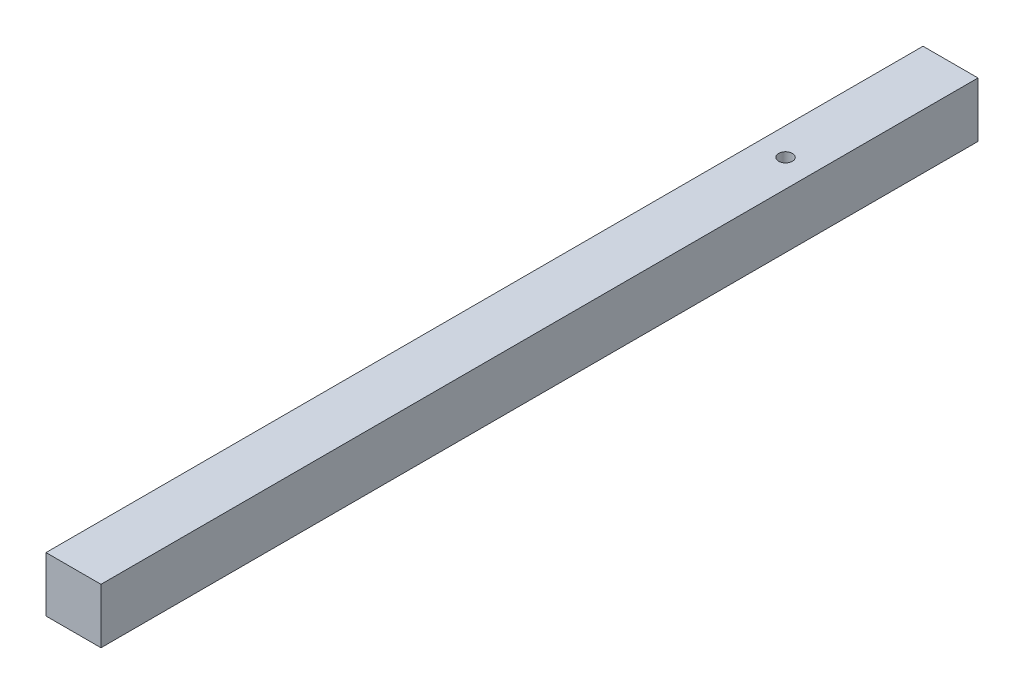
ISO-10303-21;
HEADER;
FILE_DESCRIPTION(('STEP AP214'),'2;1');
FILE_NAME('part.step','',(''),(''),'','','');
FILE_SCHEMA(('AUTOMOTIVE_DESIGN { 1 0 10303 214 1 1 1 1 }'));
ENDSEC;
DATA;
#1=APPLICATION_CONTEXT('core data for automotive mechanical design processes');
#2=APPLICATION_PROTOCOL_DEFINITION('international standard','automotive_design',2000,#1);
#3=PRODUCT_CONTEXT('',#1,'mechanical');
#4=PRODUCT('Part','Part','',(#3));
#5=PRODUCT_RELATED_PRODUCT_CATEGORY('part','',(#4));
#6=PRODUCT_DEFINITION_FORMATION('','',#4);
#7=PRODUCT_DEFINITION_CONTEXT('part definition',#1,'design');
#8=PRODUCT_DEFINITION('design','',#6,#7);
#9=PRODUCT_DEFINITION_SHAPE('','',#8);
#10=(LENGTH_UNIT() NAMED_UNIT(*) SI_UNIT(.MILLI.,.METRE.));
#11=(NAMED_UNIT(*) PLANE_ANGLE_UNIT() SI_UNIT($,.RADIAN.));
#12=(NAMED_UNIT(*) SI_UNIT($,.STERADIAN.) SOLID_ANGLE_UNIT());
#13=UNCERTAINTY_MEASURE_WITH_UNIT(LENGTH_MEASURE(1.E-05),#10,'distance_accuracy_value','');
#14=(GEOMETRIC_REPRESENTATION_CONTEXT(3) GLOBAL_UNCERTAINTY_ASSIGNED_CONTEXT((#13)) GLOBAL_UNIT_ASSIGNED_CONTEXT((#10,
#11,#12)) REPRESENTATION_CONTEXT('',''));
#15=CARTESIAN_POINT('',(0.,0.,0.));
#16=DIRECTION('',(0.,0.,1.));
#17=DIRECTION('',(1.,0.,0.));
#18=AXIS2_PLACEMENT_3D('',#15,#16,#17);
#19=CARTESIAN_POINT('',(0.,0.,319.));
#20=DIRECTION('',(1.,0.,0.));
#21=DIRECTION('',(0.,0.,-1.));
#22=AXIS2_PLACEMENT_3D('',#19,#20,#21);
#23=PLANE('',#22);
#24=DIRECTION('',(0.,-1.,0.));
#25=VECTOR('',#24,1.);
#26=CARTESIAN_POINT('',(0.,0.,0.));
#27=LINE('',#26,#25);
#28=CARTESIAN_POINT('',(0.,20.,0.));
#29=VERTEX_POINT('',#28);
#30=CARTESIAN_POINT('',(0.,0.,0.));
#31=VERTEX_POINT('',#30);
#32=EDGE_CURVE('E112',#29,#31,#27,.T.);
#33=ORIENTED_EDGE('',*,*,#32,.T.);
#34=DIRECTION('',(0.,0.,-1.));
#35=VECTOR('',#34,1.);
#36=CARTESIAN_POINT('',(0.,0.,319.));
#37=LINE('',#36,#35);
#38=CARTESIAN_POINT('',(0.,0.,319.));
#39=VERTEX_POINT('',#38);
#40=EDGE_CURVE('E11',#39,#31,#37,.T.);
#41=ORIENTED_EDGE('',*,*,#40,.F.);
#42=DIRECTION('',(0.,-1.,0.));
#43=VECTOR('',#42,1.);
#44=CARTESIAN_POINT('',(0.,0.,319.));
#45=LINE('',#44,#43);
#46=CARTESIAN_POINT('',(0.,20.,319.));
#47=VERTEX_POINT('',#46);
#48=EDGE_CURVE('E96',#47,#39,#45,.T.);
#49=ORIENTED_EDGE('',*,*,#48,.F.);
#50=DIRECTION('',(0.,0.,-1.));
#51=VECTOR('',#50,1.);
#52=CARTESIAN_POINT('',(0.,20.,319.));
#53=LINE('',#52,#51);
#54=EDGE_CURVE('E108',#47,#29,#53,.T.);
#55=ORIENTED_EDGE('',*,*,#54,.T.);
#56=EDGE_LOOP('',(#33,#41,#49,#55));
#57=FACE_BOUND('',#56,.T.);
#58=ADVANCED_FACE('F44',(#57),#23,.F.);
#59=CARTESIAN_POINT('',(0.,0.,319.));
#60=DIRECTION('',(0.,1.,0.));
#61=DIRECTION('',(0.,0.,1.));
#62=AXIS2_PLACEMENT_3D('',#59,#60,#61);
#63=PLANE('',#62);
#64=DIRECTION('',(1.,0.,0.));
#65=VECTOR('',#64,1.);
#66=CARTESIAN_POINT('',(0.,0.,0.));
#67=LINE('',#66,#65);
#68=CARTESIAN_POINT('',(20.,0.,0.));
#69=VERTEX_POINT('',#68);
#70=EDGE_CURVE('E101',#31,#69,#67,.T.);
#71=ORIENTED_EDGE('',*,*,#70,.T.);
#72=DIRECTION('',(0.,0.,-1.));
#73=VECTOR('',#72,1.);
#74=CARTESIAN_POINT('',(20.,0.,319.));
#75=LINE('',#74,#73);
#76=CARTESIAN_POINT('',(20.,0.,319.));
#77=VERTEX_POINT('',#76);
#78=EDGE_CURVE('E53',#77,#69,#75,.T.);
#79=ORIENTED_EDGE('',*,*,#78,.F.);
#80=DIRECTION('',(1.,0.,0.));
#81=VECTOR('',#80,1.);
#82=CARTESIAN_POINT('',(0.,0.,319.));
#83=LINE('',#82,#81);
#84=EDGE_CURVE('E91',#39,#77,#83,.T.);
#85=ORIENTED_EDGE('',*,*,#84,.F.);
#86=ORIENTED_EDGE('',*,*,#40,.T.);
#87=EDGE_LOOP('',(#71,#79,#85,#86));
#88=FACE_BOUND('',#87,.T.);
#89=ADVANCED_FACE('F100',(#88),#63,.F.);
#90=CARTESIAN_POINT('',(20.,0.,319.));
#91=DIRECTION('',(-1.,0.,0.));
#92=DIRECTION('',(0.,0.,1.));
#93=AXIS2_PLACEMENT_3D('',#90,#91,#92);
#94=PLANE('',#93);
#95=DIRECTION('',(0.,1.,0.));
#96=VECTOR('',#95,1.);
#97=CARTESIAN_POINT('',(20.,0.,0.));
#98=LINE('',#97,#96);
#99=CARTESIAN_POINT('',(20.,20.,0.));
#100=VERTEX_POINT('',#99);
#101=EDGE_CURVE('E78',#69,#100,#98,.T.);
#102=ORIENTED_EDGE('',*,*,#101,.T.);
#103=DIRECTION('',(0.,0.,-1.));
#104=VECTOR('',#103,1.);
#105=CARTESIAN_POINT('',(20.,20.,319.));
#106=LINE('',#105,#104);
#107=CARTESIAN_POINT('',(20.,20.,319.));
#108=VERTEX_POINT('',#107);
#109=EDGE_CURVE('E103',#108,#100,#106,.T.);
#110=ORIENTED_EDGE('',*,*,#109,.F.);
#111=DIRECTION('',(0.,1.,0.));
#112=VECTOR('',#111,1.);
#113=CARTESIAN_POINT('',(20.,0.,319.));
#114=LINE('',#113,#112);
#115=EDGE_CURVE('E94',#77,#108,#114,.T.);
#116=ORIENTED_EDGE('',*,*,#115,.F.);
#117=ORIENTED_EDGE('',*,*,#78,.T.);
#118=EDGE_LOOP('',(#102,#110,#116,#117));
#119=FACE_BOUND('',#118,.T.);
#120=ADVANCED_FACE('F104',(#119),#94,.F.);
#121=CARTESIAN_POINT('',(0.,20.,319.));
#122=DIRECTION('',(0.,-1.,0.));
#123=DIRECTION('',(0.,0.,-1.));
#124=AXIS2_PLACEMENT_3D('',#121,#122,#123);
#125=PLANE('',#124);
#126=CARTESIAN_POINT('',(10.,20.,60.));
#127=DIRECTION('',(0.,1.,0.));
#128=DIRECTION('',(0.,0.,1.));
#129=AXIS2_PLACEMENT_3D('',#126,#127,#128);
#130=CIRCLE('',#129,2.5);
#131=CARTESIAN_POINT('',(10.,20.,62.5));
#132=VERTEX_POINT('',#131);
#133=EDGE_CURVE('E133',#132,#132,#130,.T.);
#134=ORIENTED_EDGE('',*,*,#133,.F.);
#135=EDGE_LOOP('',(#134));
#136=FACE_BOUND('',#135,.T.);
#137=DIRECTION('',(-1.,0.,0.));
#138=VECTOR('',#137,1.);
#139=CARTESIAN_POINT('',(0.,20.,0.));
#140=LINE('',#139,#138);
#141=EDGE_CURVE('E84',#100,#29,#140,.T.);
#142=ORIENTED_EDGE('',*,*,#141,.T.);
#143=ORIENTED_EDGE('',*,*,#54,.F.);
#144=DIRECTION('',(-1.,0.,0.));
#145=VECTOR('',#144,1.);
#146=CARTESIAN_POINT('',(0.,20.,319.));
#147=LINE('',#146,#145);
#148=EDGE_CURVE('E61',#108,#47,#147,.T.);
#149=ORIENTED_EDGE('',*,*,#148,.F.);
#150=ORIENTED_EDGE('',*,*,#109,.T.);
#151=EDGE_LOOP('',(#142,#143,#149,#150));
#152=FACE_BOUND('',#151,.T.);
#153=ADVANCED_FACE('F126',(#136,#152),#125,.F.);
#154=CARTESIAN_POINT('',(0.,0.,319.));
#155=DIRECTION('',(0.,0.,-1.));
#156=DIRECTION('',(-1.,0.,0.));
#157=AXIS2_PLACEMENT_3D('',#154,#155,#156);
#158=PLANE('',#157);
#159=ORIENTED_EDGE('',*,*,#48,.T.);
#160=ORIENTED_EDGE('',*,*,#84,.T.);
#161=ORIENTED_EDGE('',*,*,#115,.T.);
#162=ORIENTED_EDGE('',*,*,#148,.T.);
#163=EDGE_LOOP('',(#159,#160,#161,#162));
#164=FACE_BOUND('',#163,.T.);
#165=ADVANCED_FACE('F92',(#164),#158,.F.);
#166=CARTESIAN_POINT('',(0.,0.,0.));
#167=DIRECTION('',(0.,0.,-1.));
#168=DIRECTION('',(-1.,0.,0.));
#169=AXIS2_PLACEMENT_3D('',#166,#167,#168);
#170=PLANE('',#169);
#171=ORIENTED_EDGE('',*,*,#32,.F.);
#172=ORIENTED_EDGE('',*,*,#141,.F.);
#173=ORIENTED_EDGE('',*,*,#101,.F.);
#174=ORIENTED_EDGE('',*,*,#70,.F.);
#175=EDGE_LOOP('',(#171,#172,#173,#174));
#176=FACE_BOUND('',#175,.T.);
#177=ADVANCED_FACE('F129',(#176),#170,.T.);
#178=CARTESIAN_POINT('',(10.,10.,60.));
#179=DIRECTION('',(0.,1.,0.));
#180=DIRECTION('',(0.,0.,1.));
#181=AXIS2_PLACEMENT_3D('',#178,#179,#180);
#182=CYLINDRICAL_SURFACE('',#181,2.5);
#183=CARTESIAN_POINT('',(10.,10.,60.));
#184=DIRECTION('',(0.,1.,0.));
#185=DIRECTION('',(0.,0.,1.));
#186=AXIS2_PLACEMENT_3D('',#183,#184,#185);
#187=CIRCLE('',#186,2.5);
#188=CARTESIAN_POINT('',(10.,10.,62.5));
#189=VERTEX_POINT('',#188);
#190=EDGE_CURVE('E116',#189,#189,#187,.T.);
#191=ORIENTED_EDGE('',*,*,#190,.F.);
#192=EDGE_LOOP('',(#191));
#193=FACE_BOUND('',#192,.T.);
#194=ORIENTED_EDGE('',*,*,#133,.T.);
#195=EDGE_LOOP('',(#194));
#196=FACE_BOUND('',#195,.T.);
#197=ADVANCED_FACE('F143',(#193,#196),#182,.F.);
#198=CARTESIAN_POINT('',(10.,10.,60.));
#199=DIRECTION('',(0.,1.,0.));
#200=DIRECTION('',(0.,0.,1.));
#201=AXIS2_PLACEMENT_3D('',#198,#199,#200);
#202=PLANE('',#201);
#203=ORIENTED_EDGE('',*,*,#190,.T.);
#204=EDGE_LOOP('',(#203));
#205=FACE_BOUND('',#204,.T.);
#206=ADVANCED_FACE('F141',(#205),#202,.T.);
#207=CLOSED_SHELL('',(#58,#89,#120,#153,#165,#177,#197,#206));
#208=MANIFOLD_SOLID_BREP('B2',#207);
#209=ADVANCED_BREP_SHAPE_REPRESENTATION('',(#18,#208),#14);
#210=SHAPE_DEFINITION_REPRESENTATION(#9,#209);
ENDSEC;
END-ISO-10303-21;
